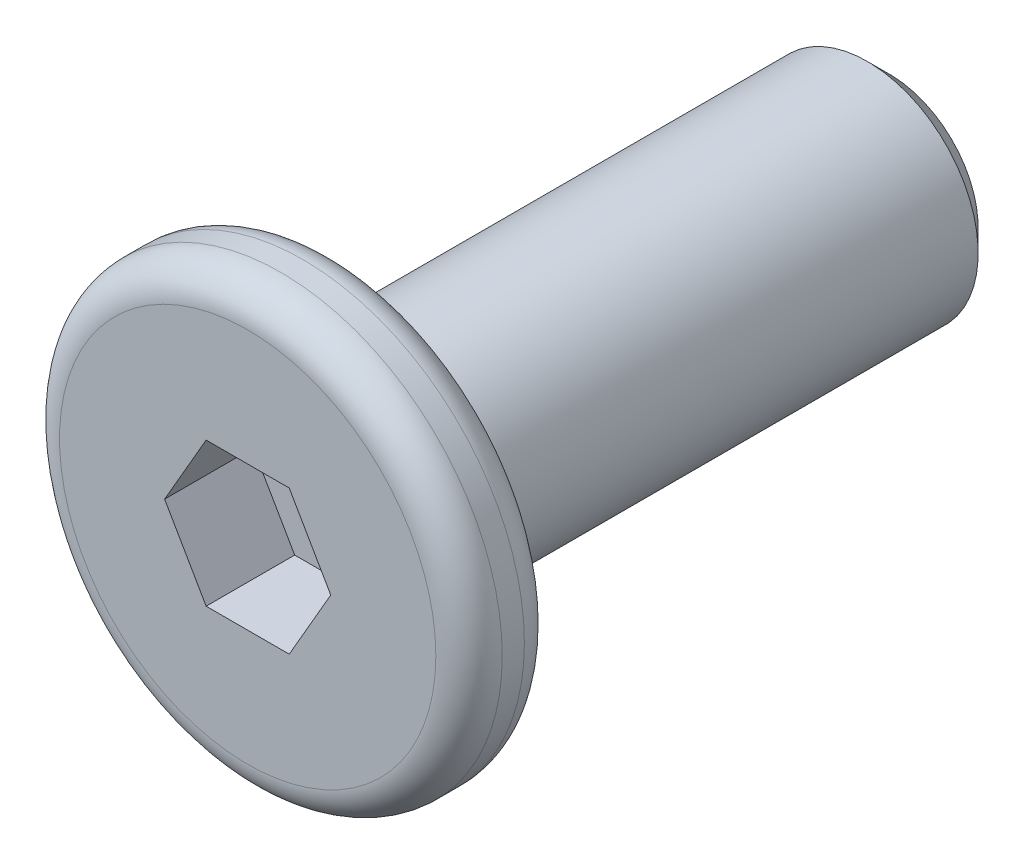
ISO-10303-21;
HEADER;
FILE_DESCRIPTION(('STEP AP214'),'2;1');
FILE_NAME('part.step','',(''),(''),'','','');
FILE_SCHEMA(('AUTOMOTIVE_DESIGN { 1 0 10303 214 1 1 1 1 }'));
ENDSEC;
DATA;
#1=APPLICATION_CONTEXT('core data for automotive mechanical design processes');
#2=APPLICATION_PROTOCOL_DEFINITION('international standard','automotive_design',2000,#1);
#3=PRODUCT_CONTEXT('',#1,'mechanical');
#4=PRODUCT('Part','Part','',(#3));
#5=PRODUCT_RELATED_PRODUCT_CATEGORY('part','',(#4));
#6=PRODUCT_DEFINITION_FORMATION('','',#4);
#7=PRODUCT_DEFINITION_CONTEXT('part definition',#1,'design');
#8=PRODUCT_DEFINITION('design','',#6,#7);
#9=PRODUCT_DEFINITION_SHAPE('','',#8);
#10=(LENGTH_UNIT() NAMED_UNIT(*) SI_UNIT(.MILLI.,.METRE.));
#11=(NAMED_UNIT(*) PLANE_ANGLE_UNIT() SI_UNIT($,.RADIAN.));
#12=(NAMED_UNIT(*) SI_UNIT($,.STERADIAN.) SOLID_ANGLE_UNIT());
#13=UNCERTAINTY_MEASURE_WITH_UNIT(LENGTH_MEASURE(1.E-05),#10,'distance_accuracy_value','');
#14=(GEOMETRIC_REPRESENTATION_CONTEXT(3) GLOBAL_UNCERTAINTY_ASSIGNED_CONTEXT((#13)) GLOBAL_UNIT_ASSIGNED_CONTEXT((#10,
#11,#12)) REPRESENTATION_CONTEXT('',''));
#15=CARTESIAN_POINT('',(0.,0.,0.));
#16=DIRECTION('',(0.,0.,1.));
#17=DIRECTION('',(1.,0.,0.));
#18=AXIS2_PLACEMENT_3D('',#15,#16,#17);
#19=CARTESIAN_POINT('',(0.,0.,0.4));
#20=DIRECTION('',(0.,0.,-1.));
#21=DIRECTION('',(-1.,0.,0.));
#22=AXIS2_PLACEMENT_3D('',#19,#20,#21);
#23=CYLINDRICAL_SURFACE('',#22,2.);
#24=CARTESIAN_POINT('',(0.,0.,-0.1));
#25=DIRECTION('',(0.,0.,1.));
#26=DIRECTION('',(1.,0.,0.));
#27=AXIS2_PLACEMENT_3D('',#24,#25,#26);
#28=CIRCLE('',#27,2.);
#29=CARTESIAN_POINT('',(2.,0.,-0.1));
#30=VERTEX_POINT('',#29);
#31=EDGE_CURVE('E154',#30,#30,#28,.T.);
#32=ORIENTED_EDGE('',*,*,#31,.T.);
#33=EDGE_LOOP('',(#32));
#34=FACE_BOUND('',#33,.T.);
#35=CARTESIAN_POINT('',(0.,0.,0.1));
#36=DIRECTION('',(0.,0.,1.));
#37=DIRECTION('',(1.,0.,0.));
#38=AXIS2_PLACEMENT_3D('',#35,#36,#37);
#39=CIRCLE('',#38,2.);
#40=CARTESIAN_POINT('',(2.,0.,0.1));
#41=VERTEX_POINT('',#40);
#42=EDGE_CURVE('E151',#41,#41,#39,.F.);
#43=ORIENTED_EDGE('',*,*,#42,.T.);
#44=EDGE_LOOP('',(#43));
#45=FACE_BOUND('',#44,.T.);
#46=ADVANCED_FACE('F35',(#34,#45),#23,.T.);
#47=CARTESIAN_POINT('',(0.,0.,0.4));
#48=DIRECTION('',(0.,0.,1.));
#49=DIRECTION('',(1.,0.,0.));
#50=AXIS2_PLACEMENT_3D('',#47,#48,#49);
#51=PLANE('',#50);
#52=CARTESIAN_POINT('',(0.,0.,0.4));
#53=DIRECTION('',(0.,0.,1.));
#54=DIRECTION('',(1.,0.,0.));
#55=AXIS2_PLACEMENT_3D('',#52,#53,#54);
#56=CIRCLE('',#55,1.7);
#57=CARTESIAN_POINT('',(1.7,0.,0.4));
#58=VERTEX_POINT('',#57);
#59=EDGE_CURVE('E11',#58,#58,#56,.T.);
#60=ORIENTED_EDGE('',*,*,#59,.T.);
#61=EDGE_LOOP('',(#60));
#62=FACE_BOUND('',#61,.T.);
#63=DIRECTION('',(0.5,0.866025403784439,0.));
#64=VECTOR('',#63,1.);
#65=CARTESIAN_POINT('',(0.375277674973257,-0.65,0.4));
#66=LINE('',#65,#64);
#67=CARTESIAN_POINT('',(0.375277674973257,-0.65,0.4));
#68=VERTEX_POINT('',#67);
#69=CARTESIAN_POINT('',(0.750555349946514,0.,0.4));
#70=VERTEX_POINT('',#69);
#71=EDGE_CURVE('E50',#68,#70,#66,.T.);
#72=ORIENTED_EDGE('',*,*,#71,.F.);
#73=DIRECTION('',(1.,0.,0.));
#74=VECTOR('',#73,1.);
#75=CARTESIAN_POINT('',(-0.375277674973256,-0.65,0.4));
#76=LINE('',#75,#74);
#77=CARTESIAN_POINT('',(-0.375277674973256,-0.65,0.4));
#78=VERTEX_POINT('',#77);
#79=EDGE_CURVE('E133',#78,#68,#76,.T.);
#80=ORIENTED_EDGE('',*,*,#79,.F.);
#81=DIRECTION('',(0.5,-0.866025403784438,0.));
#82=VECTOR('',#81,1.);
#83=CARTESIAN_POINT('',(-0.750555349946513,0.,0.4));
#84=LINE('',#83,#82);
#85=CARTESIAN_POINT('',(-0.750555349946513,0.,0.4));
#86=VERTEX_POINT('',#85);
#87=EDGE_CURVE('E131',#86,#78,#84,.T.);
#88=ORIENTED_EDGE('',*,*,#87,.F.);
#89=DIRECTION('',(-0.5,-0.866025403784439,0.));
#90=VECTOR('',#89,1.);
#91=CARTESIAN_POINT('',(-0.375277674973257,0.65,0.4));
#92=LINE('',#91,#90);
#93=CARTESIAN_POINT('',(-0.375277674973257,0.65,0.4));
#94=VERTEX_POINT('',#93);
#95=EDGE_CURVE('E98',#94,#86,#92,.T.);
#96=ORIENTED_EDGE('',*,*,#95,.F.);
#97=DIRECTION('',(-1.,0.,0.));
#98=VECTOR('',#97,1.);
#99=CARTESIAN_POINT('',(0.375277674973257,0.65,0.4));
#100=LINE('',#99,#98);
#101=CARTESIAN_POINT('',(0.375277674973257,0.65,0.4));
#102=VERTEX_POINT('',#101);
#103=EDGE_CURVE('E127',#102,#94,#100,.T.);
#104=ORIENTED_EDGE('',*,*,#103,.F.);
#105=DIRECTION('',(-0.5,0.866025403784439,0.));
#106=VECTOR('',#105,1.);
#107=CARTESIAN_POINT('',(0.750555349946514,0.,0.4));
#108=LINE('',#107,#106);
#109=EDGE_CURVE('E124',#70,#102,#108,.T.);
#110=ORIENTED_EDGE('',*,*,#109,.F.);
#111=EDGE_LOOP('',(#72,#80,#88,#96,#104,#110));
#112=FACE_BOUND('',#111,.T.);
#113=ADVANCED_FACE('F169',(#62,#112),#51,.T.);
#114=CARTESIAN_POINT('',(0.,0.,-0.4));
#115=DIRECTION('',(0.,0.,1.));
#116=DIRECTION('',(1.,0.,0.));
#117=AXIS2_PLACEMENT_3D('',#114,#115,#116);
#118=PLANE('',#117);
#119=CARTESIAN_POINT('',(0.,0.,-0.4));
#120=DIRECTION('',(0.,0.,1.));
#121=DIRECTION('',(1.,0.,0.));
#122=AXIS2_PLACEMENT_3D('',#119,#120,#121);
#123=CIRCLE('',#122,1.7);
#124=CARTESIAN_POINT('',(1.7,0.,-0.4));
#125=VERTEX_POINT('',#124);
#126=EDGE_CURVE('E43',#125,#125,#123,.F.);
#127=ORIENTED_EDGE('',*,*,#126,.T.);
#128=EDGE_LOOP('',(#127));
#129=FACE_BOUND('',#128,.T.);
#130=CARTESIAN_POINT('',(0.,0.,-0.4));
#131=DIRECTION('',(0.,0.,-1.));
#132=DIRECTION('',(-1.,0.,0.));
#133=AXIS2_PLACEMENT_3D('',#130,#131,#132);
#134=CIRCLE('',#133,1.);
#135=CARTESIAN_POINT('',(-1.,0.,-0.4));
#136=VERTEX_POINT('',#135);
#137=EDGE_CURVE('E137',#136,#136,#134,.T.);
#138=ORIENTED_EDGE('',*,*,#137,.F.);
#139=EDGE_LOOP('',(#138));
#140=FACE_BOUND('',#139,.T.);
#141=ADVANCED_FACE('F159',(#129,#140),#118,.F.);
#142=CARTESIAN_POINT('',(0.,0.,-5.4));
#143=DIRECTION('',(0.,0.,1.));
#144=DIRECTION('',(1.,0.,0.));
#145=AXIS2_PLACEMENT_3D('',#142,#143,#144);
#146=CYLINDRICAL_SURFACE('',#145,1.);
#147=CARTESIAN_POINT('',(0.,0.,-5.2));
#148=DIRECTION('',(0.,0.,-1.));
#149=DIRECTION('',(-1.,0.,0.));
#150=AXIS2_PLACEMENT_3D('',#147,#148,#149);
#151=CIRCLE('',#150,1.);
#152=CARTESIAN_POINT('',(-1.,0.,-5.2));
#153=VERTEX_POINT('',#152);
#154=EDGE_CURVE('E148',#153,#153,#151,.F.);
#155=ORIENTED_EDGE('',*,*,#154,.T.);
#156=EDGE_LOOP('',(#155));
#157=FACE_BOUND('',#156,.T.);
#158=ORIENTED_EDGE('',*,*,#137,.T.);
#159=EDGE_LOOP('',(#158));
#160=FACE_BOUND('',#159,.T.);
#161=ADVANCED_FACE('F204',(#157,#160),#146,.T.);
#162=CARTESIAN_POINT('',(0.,0.,-5.4));
#163=DIRECTION('',(0.,0.,-1.));
#164=DIRECTION('',(-1.,0.,0.));
#165=AXIS2_PLACEMENT_3D('',#162,#163,#164);
#166=PLANE('',#165);
#167=CARTESIAN_POINT('',(0.,0.,-5.4));
#168=DIRECTION('',(0.,0.,-1.));
#169=DIRECTION('',(-1.,0.,0.));
#170=AXIS2_PLACEMENT_3D('',#167,#168,#169);
#171=CIRCLE('',#170,0.8);
#172=CARTESIAN_POINT('',(-0.8,0.,-5.4));
#173=VERTEX_POINT('',#172);
#174=EDGE_CURVE('E145',#173,#173,#171,.T.);
#175=ORIENTED_EDGE('',*,*,#174,.T.);
#176=EDGE_LOOP('',(#175));
#177=FACE_BOUND('',#176,.T.);
#178=ADVANCED_FACE('F196',(#177),#166,.T.);
#179=CARTESIAN_POINT('',(0.,0.,-5.4));
#180=DIRECTION('',(0.,0.,1.));
#181=DIRECTION('',(1.,0.,0.));
#182=AXIS2_PLACEMENT_3D('',#179,#180,#181);
#183=CONICAL_SURFACE('',#182,0.8,0.785398163397446);
#184=ORIENTED_EDGE('',*,*,#154,.F.);
#185=EDGE_LOOP('',(#184));
#186=FACE_BOUND('',#185,.T.);
#187=ORIENTED_EDGE('',*,*,#174,.F.);
#188=EDGE_LOOP('',(#187));
#189=FACE_BOUND('',#188,.T.);
#190=ADVANCED_FACE('F189',(#186,#189),#183,.T.);
#191=CARTESIAN_POINT('',(0.375277674973257,-0.65,-0.4));
#192=DIRECTION('',(0.866025403784439,-0.5,0.));
#193=DIRECTION('',(0.5,0.866025403784439,0.));
#194=AXIS2_PLACEMENT_3D('',#191,#192,#193);
#195=PLANE('',#194);
#196=ORIENTED_EDGE('',*,*,#71,.T.);
#197=DIRECTION('',(0.,0.,1.));
#198=VECTOR('',#197,1.);
#199=CARTESIAN_POINT('',(0.750555349946514,0.,-0.4));
#200=LINE('',#199,#198);
#201=CARTESIAN_POINT('',(0.750555349946514,0.,-0.4));
#202=VERTEX_POINT('',#201);
#203=EDGE_CURVE('E80',#202,#70,#200,.T.);
#204=ORIENTED_EDGE('',*,*,#203,.F.);
#205=DIRECTION('',(0.5,0.866025403784439,0.));
#206=VECTOR('',#205,1.);
#207=CARTESIAN_POINT('',(0.375277674973257,-0.65,-0.4));
#208=LINE('',#207,#206);
#209=CARTESIAN_POINT('',(0.375277674973257,-0.65,-0.4));
#210=VERTEX_POINT('',#209);
#211=EDGE_CURVE('E135',#210,#202,#208,.T.);
#212=ORIENTED_EDGE('',*,*,#211,.F.);
#213=DIRECTION('',(0.,0.,1.));
#214=VECTOR('',#213,1.);
#215=CARTESIAN_POINT('',(0.375277674973257,-0.65,-0.4));
#216=LINE('',#215,#214);
#217=EDGE_CURVE('E58',#210,#68,#216,.T.);
#218=ORIENTED_EDGE('',*,*,#217,.T.);
#219=EDGE_LOOP('',(#196,#204,#212,#218));
#220=FACE_BOUND('',#219,.T.);
#221=ADVANCED_FACE('F186',(#220),#195,.F.);
#222=CARTESIAN_POINT('',(-0.375277674973256,-0.65,-0.4));
#223=DIRECTION('',(0.,-1.,0.));
#224=DIRECTION('',(1.,0.,0.));
#225=AXIS2_PLACEMENT_3D('',#222,#223,#224);
#226=PLANE('',#225);
#227=ORIENTED_EDGE('',*,*,#79,.T.);
#228=ORIENTED_EDGE('',*,*,#217,.F.);
#229=DIRECTION('',(1.,0.,0.));
#230=VECTOR('',#229,1.);
#231=CARTESIAN_POINT('',(-0.375277674973256,-0.65,-0.4));
#232=LINE('',#231,#230);
#233=CARTESIAN_POINT('',(-0.375277674973256,-0.65,-0.4));
#234=VERTEX_POINT('',#233);
#235=EDGE_CURVE('E110',#234,#210,#232,.T.);
#236=ORIENTED_EDGE('',*,*,#235,.F.);
#237=DIRECTION('',(0.,0.,1.));
#238=VECTOR('',#237,1.);
#239=CARTESIAN_POINT('',(-0.375277674973256,-0.65,-0.4));
#240=LINE('',#239,#238);
#241=EDGE_CURVE('E102',#234,#78,#240,.T.);
#242=ORIENTED_EDGE('',*,*,#241,.T.);
#243=EDGE_LOOP('',(#227,#228,#236,#242));
#244=FACE_BOUND('',#243,.T.);
#245=ADVANCED_FACE('F188',(#244),#226,.F.);
#246=CARTESIAN_POINT('',(-0.750555349946513,0.,-0.4));
#247=DIRECTION('',(-0.866025403784438,-0.5,0.));
#248=DIRECTION('',(0.5,-0.866025403784439,0.));
#249=AXIS2_PLACEMENT_3D('',#246,#247,#248);
#250=PLANE('',#249);
#251=ORIENTED_EDGE('',*,*,#87,.T.);
#252=ORIENTED_EDGE('',*,*,#241,.F.);
#253=DIRECTION('',(0.5,-0.866025403784438,0.));
#254=VECTOR('',#253,1.);
#255=CARTESIAN_POINT('',(-0.750555349946513,0.,-0.4));
#256=LINE('',#255,#254);
#257=CARTESIAN_POINT('',(-0.750555349946513,0.,-0.4));
#258=VERTEX_POINT('',#257);
#259=EDGE_CURVE('E106',#258,#234,#256,.T.);
#260=ORIENTED_EDGE('',*,*,#259,.F.);
#261=DIRECTION('',(0.,0.,1.));
#262=VECTOR('',#261,1.);
#263=CARTESIAN_POINT('',(-0.750555349946513,0.,-0.4));
#264=LINE('',#263,#262);
#265=EDGE_CURVE('E91',#258,#86,#264,.T.);
#266=ORIENTED_EDGE('',*,*,#265,.T.);
#267=EDGE_LOOP('',(#251,#252,#260,#266));
#268=FACE_BOUND('',#267,.T.);
#269=ADVANCED_FACE('F107',(#268),#250,.F.);
#270=CARTESIAN_POINT('',(-0.375277674973257,0.65,-0.4));
#271=DIRECTION('',(-0.866025403784439,0.5,0.));
#272=DIRECTION('',(-0.5,-0.866025403784439,0.));
#273=AXIS2_PLACEMENT_3D('',#270,#271,#272);
#274=PLANE('',#273);
#275=ORIENTED_EDGE('',*,*,#95,.T.);
#276=ORIENTED_EDGE('',*,*,#265,.F.);
#277=DIRECTION('',(-0.5,-0.866025403784439,0.));
#278=VECTOR('',#277,1.);
#279=CARTESIAN_POINT('',(-0.375277674973257,0.65,-0.4));
#280=LINE('',#279,#278);
#281=CARTESIAN_POINT('',(-0.375277674973257,0.65,-0.4));
#282=VERTEX_POINT('',#281);
#283=EDGE_CURVE('E95',#282,#258,#280,.T.);
#284=ORIENTED_EDGE('',*,*,#283,.F.);
#285=DIRECTION('',(0.,0.,1.));
#286=VECTOR('',#285,1.);
#287=CARTESIAN_POINT('',(-0.375277674973257,0.65,-0.4));
#288=LINE('',#287,#286);
#289=EDGE_CURVE('E103',#282,#94,#288,.T.);
#290=ORIENTED_EDGE('',*,*,#289,.T.);
#291=EDGE_LOOP('',(#275,#276,#284,#290));
#292=FACE_BOUND('',#291,.T.);
#293=ADVANCED_FACE('F93',(#292),#274,.F.);
#294=CARTESIAN_POINT('',(0.375277674973257,0.65,-0.4));
#295=DIRECTION('',(0.,1.,0.));
#296=DIRECTION('',(0.,0.,1.));
#297=AXIS2_PLACEMENT_3D('',#294,#295,#296);
#298=PLANE('',#297);
#299=ORIENTED_EDGE('',*,*,#103,.T.);
#300=ORIENTED_EDGE('',*,*,#289,.F.);
#301=DIRECTION('',(-1.,0.,0.));
#302=VECTOR('',#301,1.);
#303=CARTESIAN_POINT('',(0.375277674973257,0.65,-0.4));
#304=LINE('',#303,#302);
#305=CARTESIAN_POINT('',(0.375277674973257,0.65,-0.4));
#306=VERTEX_POINT('',#305);
#307=EDGE_CURVE('E116',#306,#282,#304,.T.);
#308=ORIENTED_EDGE('',*,*,#307,.F.);
#309=DIRECTION('',(0.,0.,1.));
#310=VECTOR('',#309,1.);
#311=CARTESIAN_POINT('',(0.375277674973257,0.65,-0.4));
#312=LINE('',#311,#310);
#313=EDGE_CURVE('E140',#306,#102,#312,.T.);
#314=ORIENTED_EDGE('',*,*,#313,.T.);
#315=EDGE_LOOP('',(#299,#300,#308,#314));
#316=FACE_BOUND('',#315,.T.);
#317=ADVANCED_FACE('F257',(#316),#298,.F.);
#318=CARTESIAN_POINT('',(0.750555349946514,0.,-0.4));
#319=DIRECTION('',(0.866025403784439,0.5,0.));
#320=DIRECTION('',(-0.5,0.866025403784439,0.));
#321=AXIS2_PLACEMENT_3D('',#318,#319,#320);
#322=PLANE('',#321);
#323=ORIENTED_EDGE('',*,*,#109,.T.);
#324=ORIENTED_EDGE('',*,*,#313,.F.);
#325=DIRECTION('',(-0.5,0.866025403784439,0.));
#326=VECTOR('',#325,1.);
#327=CARTESIAN_POINT('',(0.750555349946514,0.,-0.4));
#328=LINE('',#327,#326);
#329=EDGE_CURVE('E118',#202,#306,#328,.T.);
#330=ORIENTED_EDGE('',*,*,#329,.F.);
#331=ORIENTED_EDGE('',*,*,#203,.T.);
#332=EDGE_LOOP('',(#323,#324,#330,#331));
#333=FACE_BOUND('',#332,.T.);
#334=ADVANCED_FACE('F184',(#333),#322,.F.);
#335=CARTESIAN_POINT('',(0.,0.,-0.4));
#336=DIRECTION('',(0.,0.,1.));
#337=DIRECTION('',(1.,0.,0.));
#338=AXIS2_PLACEMENT_3D('',#335,#336,#337);
#339=PLANE('',#338);
#340=ORIENTED_EDGE('',*,*,#211,.T.);
#341=ORIENTED_EDGE('',*,*,#329,.T.);
#342=ORIENTED_EDGE('',*,*,#307,.T.);
#343=ORIENTED_EDGE('',*,*,#283,.T.);
#344=ORIENTED_EDGE('',*,*,#259,.T.);
#345=ORIENTED_EDGE('',*,*,#235,.T.);
#346=EDGE_LOOP('',(#340,#341,#342,#343,#344,#345));
#347=FACE_BOUND('',#346,.T.);
#348=ADVANCED_FACE('F113',(#347),#339,.T.);
#349=CARTESIAN_POINT('',(0.,0.,-0.1));
#350=DIRECTION('',(0.,0.,1.));
#351=DIRECTION('',(1.,0.,0.));
#352=AXIS2_PLACEMENT_3D('',#349,#350,#351);
#353=TOROIDAL_SURFACE('',#352,1.7,0.3);
#354=ORIENTED_EDGE('',*,*,#126,.F.);
#355=EDGE_LOOP('',(#354));
#356=FACE_BOUND('',#355,.T.);
#357=ORIENTED_EDGE('',*,*,#31,.F.);
#358=EDGE_LOOP('',(#357));
#359=FACE_BOUND('',#358,.T.);
#360=ADVANCED_FACE('F162',(#356,#359),#353,.T.);
#361=CARTESIAN_POINT('',(0.,0.,0.1));
#362=DIRECTION('',(0.,0.,1.));
#363=DIRECTION('',(1.,0.,0.));
#364=AXIS2_PLACEMENT_3D('',#361,#362,#363);
#365=TOROIDAL_SURFACE('',#364,1.7,0.3);
#366=ORIENTED_EDGE('',*,*,#42,.F.);
#367=EDGE_LOOP('',(#366));
#368=FACE_BOUND('',#367,.T.);
#369=ORIENTED_EDGE('',*,*,#59,.F.);
#370=EDGE_LOOP('',(#369));
#371=FACE_BOUND('',#370,.T.);
#372=ADVANCED_FACE('F37',(#368,#371),#365,.T.);
#373=CLOSED_SHELL('',(#46,#113,#141,#161,#178,#190,#221,#245,#269,#293,#317,#334,#348,#360,#372));
#374=MANIFOLD_SOLID_BREP('B2',#373);
#375=ADVANCED_BREP_SHAPE_REPRESENTATION('',(#18,#374),#14);
#376=SHAPE_DEFINITION_REPRESENTATION(#9,#375);
ENDSEC;
END-ISO-10303-21;
